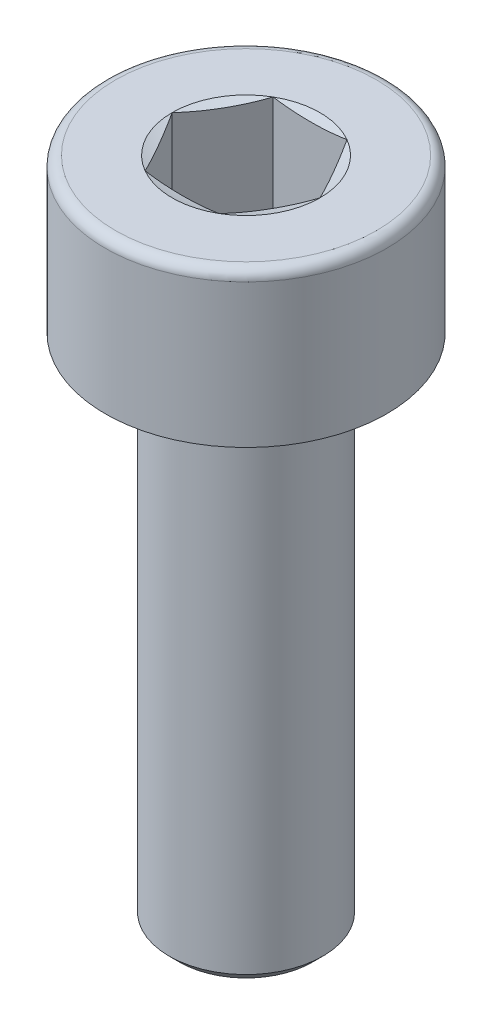
ISO-10303-21;
HEADER;
FILE_DESCRIPTION(('STEP AP214'),'2;1');
FILE_NAME('part.step','',(''),(''),'','','');
FILE_SCHEMA(('AUTOMOTIVE_DESIGN { 1 0 10303 214 1 1 1 1 }'));
ENDSEC;
DATA;
#1=APPLICATION_CONTEXT('core data for automotive mechanical design processes');
#2=APPLICATION_PROTOCOL_DEFINITION('international standard','automotive_design',2000,#1);
#3=PRODUCT_CONTEXT('',#1,'mechanical');
#4=PRODUCT('Part','Part','',(#3));
#5=PRODUCT_RELATED_PRODUCT_CATEGORY('part','',(#4));
#6=PRODUCT_DEFINITION_FORMATION('','',#4);
#7=PRODUCT_DEFINITION_CONTEXT('part definition',#1,'design');
#8=PRODUCT_DEFINITION('design','',#6,#7);
#9=PRODUCT_DEFINITION_SHAPE('','',#8);
#10=(LENGTH_UNIT() NAMED_UNIT(*) SI_UNIT(.MILLI.,.METRE.));
#11=(NAMED_UNIT(*) PLANE_ANGLE_UNIT() SI_UNIT($,.RADIAN.));
#12=(NAMED_UNIT(*) SI_UNIT($,.STERADIAN.) SOLID_ANGLE_UNIT());
#13=UNCERTAINTY_MEASURE_WITH_UNIT(LENGTH_MEASURE(1.E-05),#10,'distance_accuracy_value','');
#14=(GEOMETRIC_REPRESENTATION_CONTEXT(3) GLOBAL_UNCERTAINTY_ASSIGNED_CONTEXT((#13)) GLOBAL_UNIT_ASSIGNED_CONTEXT((#10,
#11,#12)) REPRESENTATION_CONTEXT('',''));
#15=CARTESIAN_POINT('',(0.,0.,0.));
#16=DIRECTION('',(0.,0.,1.));
#17=DIRECTION('',(1.,0.,0.));
#18=AXIS2_PLACEMENT_3D('',#15,#16,#17);
#19=CARTESIAN_POINT('',(-0.721687836487032,1.,1.25));
#20=DIRECTION('',(-0.866025403784438,0.,0.5));
#21=DIRECTION('',(0.5,0.,0.866025403784438));
#22=AXIS2_PLACEMENT_3D('',#19,#20,#21);
#23=PLANE('',#22);
#24=CARTESIAN_POINT('',(-0.721687836487032,3.,1.25));
#25=CARTESIAN_POINT('',(-0.746513124830629,2.99197238531374,1.20700133927634));
#26=CARTESIAN_POINT('',(-0.77141135372941,2.98490176746172,1.16387634180517));
#27=CARTESIAN_POINT('',(-0.821315773136171,2.97255913474823,1.07743935187044));
#28=CARTESIAN_POINT('',(-0.846321947696915,2.96728686283765,1.03412738702829));
#29=CARTESIAN_POINT('',(-0.921207679089363,2.95403550093664,0.904421495494619));
#30=CARTESIAN_POINT('',(-0.971201450687432,2.94854460534836,0.817829743024769));
#31=CARTESIAN_POINT('',(-1.05639422799085,2.94434178449894,0.670271524297353));
#32=CARTESIAN_POINT('',(-1.091578665675,2.94410115539927,0.609330290592659));
#33=CARTESIAN_POINT('',(-1.16192112047074,2.94660140173926,0.487493584957328));
#34=CARTESIAN_POINT('',(-1.19707913913524,2.94934208553123,0.426598110336958));
#35=CARTESIAN_POINT('',(-1.26754233377786,2.95799567884213,0.304552277152318));
#36=CARTESIAN_POINT('',(-1.30284686200085,2.96393024637964,0.243403040532844));
#37=CARTESIAN_POINT('',(-1.37327394982157,2.9792802908976,0.121419746198257));
#38=CARTESIAN_POINT('',(-1.40839646122585,2.98869664635053,0.0605857719566225));
#39=CARTESIAN_POINT('',(-1.44337567297407,3.,0.));
#40=B_SPLINE_CURVE_WITH_KNOTS('',3,(#24,#25,#26,#27,#28,#29,#30,#31,#32,#33,#34,#35,#36,#37,#38,
#39),.UNSPECIFIED.,.F.,.F.,(4,2,2,2,2,2,2,4),(0.,0.150861973818663,0.301702374924401,
0.601886293911623,0.812941524612173,1.02398318885367,1.23647431745907,1.44901909526101),.UNSPECIFIED.);
#41=CARTESIAN_POINT('',(-0.721687836487033,3.,1.25));
#42=VERTEX_POINT('',#41);
#43=CARTESIAN_POINT('',(-1.44337567297406,3.,0.));
#44=VERTEX_POINT('',#43);
#45=EDGE_CURVE('E81',#42,#44,#40,.T.);
#46=ORIENTED_EDGE('',*,*,#45,.F.);
#47=DIRECTION('',(0.,1.,0.));
#48=VECTOR('',#47,1.);
#49=CARTESIAN_POINT('',(-0.721687836487032,1.,1.25));
#50=LINE('',#49,#48);
#51=CARTESIAN_POINT('',(-0.721687836487032,1.,1.25));
#52=VERTEX_POINT('',#51);
#53=EDGE_CURVE('E117',#42,#52,#50,.F.);
#54=ORIENTED_EDGE('',*,*,#53,.T.);
#55=DIRECTION('',(0.5,0.,0.866025403784438));
#56=VECTOR('',#55,1.);
#57=CARTESIAN_POINT('',(-0.721687836487032,1.,1.25));
#58=LINE('',#57,#56);
#59=CARTESIAN_POINT('',(-1.44337567297406,1.,0.));
#60=VERTEX_POINT('',#59);
#61=EDGE_CURVE('E90',#60,#52,#58,.T.);
#62=ORIENTED_EDGE('',*,*,#61,.F.);
#63=DIRECTION('',(0.,1.,0.));
#64=VECTOR('',#63,1.);
#65=CARTESIAN_POINT('',(-1.44337567297406,1.,0.));
#66=LINE('',#65,#64);
#67=EDGE_CURVE('E89',#60,#44,#66,.T.);
#68=ORIENTED_EDGE('',*,*,#67,.T.);
#69=EDGE_LOOP('',(#46,#54,#62,#68));
#70=FACE_BOUND('',#69,.T.);
#71=ADVANCED_FACE('F17',(#70),#23,.F.);
#72=CARTESIAN_POINT('',(-1.44337567297406,1.,0.));
#73=DIRECTION('',(-0.866025403784439,0.,-0.5));
#74=DIRECTION('',(-0.5,0.,0.866025403784439));
#75=AXIS2_PLACEMENT_3D('',#72,#73,#74);
#76=PLANE('',#75);
#77=CARTESIAN_POINT('',(-1.44337567297407,3.,0.));
#78=CARTESIAN_POINT('',(-1.41855038463047,2.99197238531374,-0.0429986607236554));
#79=CARTESIAN_POINT('',(-1.39365215573169,2.98490176746172,-0.0861236581948242));
#80=CARTESIAN_POINT('',(-1.34374773632493,2.97255913474823,-0.17256064812956));
#81=CARTESIAN_POINT('',(-1.31874156176418,2.96728686283765,-0.215872612971706));
#82=CARTESIAN_POINT('',(-1.24385583037174,2.95403550093664,-0.34557850450538));
#83=CARTESIAN_POINT('',(-1.19386205877367,2.94854460534836,-0.43217025697523));
#84=CARTESIAN_POINT('',(-1.10866928147025,2.94434178449894,-0.579728475702645));
#85=CARTESIAN_POINT('',(-1.0734848437861,2.94410115539927,-0.640669709407339));
#86=CARTESIAN_POINT('',(-1.00314238899036,2.94660140173926,-0.762506415042671));
#87=CARTESIAN_POINT('',(-0.967984370325862,2.94934208553123,-0.823401889663041));
#88=CARTESIAN_POINT('',(-0.897521175683237,2.95799567884213,-0.945447722847682));
#89=CARTESIAN_POINT('',(-0.862216647460244,2.96393024637964,-1.00659695946716));
#90=CARTESIAN_POINT('',(-0.791789559639532,2.9792802908976,-1.12858025380174));
#91=CARTESIAN_POINT('',(-0.75666704823525,2.98869664635053,-1.18941422804338));
#92=CARTESIAN_POINT('',(-0.721687836487033,3.,-1.25));
#93=B_SPLINE_CURVE_WITH_KNOTS('',3,(#77,#78,#79,#80,#81,#82,#83,#84,#85,#86,#87,#88,#89,#90,#91,
#92),.UNSPECIFIED.,.F.,.F.,(4,2,2,2,2,2,2,4),(0.,0.150861973818663,0.3017023749244,
0.601886293911622,0.812941524612172,1.02398318885367,1.23647431745907,1.44901909526101),.UNSPECIFIED.);
#94=CARTESIAN_POINT('',(-0.721687836487032,3.,-1.25));
#95=VERTEX_POINT('',#94);
#96=EDGE_CURVE('E96',#44,#95,#93,.T.);
#97=ORIENTED_EDGE('',*,*,#96,.F.);
#98=ORIENTED_EDGE('',*,*,#67,.F.);
#99=DIRECTION('',(0.5,0.,-0.866025403784439));
#100=VECTOR('',#99,1.);
#101=CARTESIAN_POINT('',(-1.44337567297406,1.,0.));
#102=LINE('',#101,#100);
#103=CARTESIAN_POINT('',(-0.721687836487033,1.,-1.25));
#104=VERTEX_POINT('',#103);
#105=EDGE_CURVE('E228',#60,#104,#102,.T.);
#106=ORIENTED_EDGE('',*,*,#105,.T.);
#107=DIRECTION('',(0.,1.,0.));
#108=VECTOR('',#107,1.);
#109=CARTESIAN_POINT('',(-0.721687836487033,1.,-1.25));
#110=LINE('',#109,#108);
#111=EDGE_CURVE('E115',#104,#95,#110,.T.);
#112=ORIENTED_EDGE('',*,*,#111,.T.);
#113=EDGE_LOOP('',(#97,#98,#106,#112));
#114=FACE_BOUND('',#113,.T.);
#115=ADVANCED_FACE('F113',(#114),#76,.F.);
#116=CARTESIAN_POINT('',(0.721687836487032,1.,1.25));
#117=DIRECTION('',(0.,0.,1.));
#118=DIRECTION('',(1.,0.,0.));
#119=AXIS2_PLACEMENT_3D('',#116,#117,#118);
#120=PLANE('',#119);
#121=CARTESIAN_POINT('',(0.721687836487032,3.,1.25));
#122=CARTESIAN_POINT('',(0.67203725979984,2.99197238531374,1.25));
#123=CARTESIAN_POINT('',(0.622240802002277,2.98490176746172,1.25));
#124=CARTESIAN_POINT('',(0.522431963188756,2.97255913474823,1.25));
#125=CARTESIAN_POINT('',(0.472419614067266,2.96728686283765,1.25));
#126=CARTESIAN_POINT('',(0.322648151282372,2.95403550093664,1.25));
#127=CARTESIAN_POINT('',(0.222660608086233,2.94854460534836,1.25));
#128=CARTESIAN_POINT('',(0.0522750534794036,2.94434178449894,1.25));
#129=CARTESIAN_POINT('',(-0.0180938218889027,2.94410115539927,1.25));
#130=CARTESIAN_POINT('',(-0.158778731480374,2.94660140173926,1.25));
#131=CARTESIAN_POINT('',(-0.229094768809375,2.94934208553123,1.25));
#132=CARTESIAN_POINT('',(-0.370021158094624,2.95799567884213,1.25));
#133=CARTESIAN_POINT('',(-0.44063021454061,2.96393024637964,1.25));
#134=CARTESIAN_POINT('',(-0.581484390182033,2.9792802908976,1.25));
#135=CARTESIAN_POINT('',(-0.651729412990598,2.98869664635053,1.25));
#136=CARTESIAN_POINT('',(-0.721687836487032,3.,1.25));
#137=B_SPLINE_CURVE_WITH_KNOTS('',3,(#121,#122,#123,#124,#125,#126,#127,#128,#129,#130,#131,
#132,#133,#134,#135,#136),.UNSPECIFIED.,.F.,.F.,(4,2,2,2,2,2,2,4),(0.,0.150861973818663,
0.301702374924401,0.601886293911623,0.812941524612173,1.02398318885367,1.23647431745907,
1.44901909526101),.UNSPECIFIED.);
#138=CARTESIAN_POINT('',(0.721687836487031,3.,1.25));
#139=VERTEX_POINT('',#138);
#140=EDGE_CURVE('E75',#139,#42,#137,.T.);
#141=ORIENTED_EDGE('',*,*,#140,.F.);
#142=DIRECTION('',(0.,1.,0.));
#143=VECTOR('',#142,1.);
#144=CARTESIAN_POINT('',(0.721687836487032,1.,1.25));
#145=LINE('',#144,#143);
#146=CARTESIAN_POINT('',(0.721687836487032,1.,1.25));
#147=VERTEX_POINT('',#146);
#148=EDGE_CURVE('E211',#139,#147,#145,.F.);
#149=ORIENTED_EDGE('',*,*,#148,.T.);
#150=DIRECTION('',(1.,0.,0.));
#151=VECTOR('',#150,1.);
#152=CARTESIAN_POINT('',(-0.721687836487033,1.,1.25));
#153=LINE('',#152,#151);
#154=EDGE_CURVE('E232',#147,#52,#153,.F.);
#155=ORIENTED_EDGE('',*,*,#154,.T.);
#156=ORIENTED_EDGE('',*,*,#53,.F.);
#157=EDGE_LOOP('',(#141,#149,#155,#156));
#158=FACE_BOUND('',#157,.T.);
#159=ADVANCED_FACE('F138',(#158),#120,.F.);
#160=CARTESIAN_POINT('',(-0.721687836487033,1.,-1.25));
#161=DIRECTION('',(0.,-1.,0.));
#162=DIRECTION('',(0.,0.,-1.));
#163=AXIS2_PLACEMENT_3D('',#160,#161,#162);
#164=PLANE('',#163);
#165=ORIENTED_EDGE('',*,*,#61,.T.);
#166=ORIENTED_EDGE('',*,*,#154,.F.);
#167=DIRECTION('',(0.5,0.,-0.866025403784438));
#168=VECTOR('',#167,1.);
#169=CARTESIAN_POINT('',(1.44337567297406,1.,0.));
#170=LINE('',#169,#168);
#171=CARTESIAN_POINT('',(1.44337567297406,1.,0.));
#172=VERTEX_POINT('',#171);
#173=EDGE_CURVE('E160',#147,#172,#170,.T.);
#174=ORIENTED_EDGE('',*,*,#173,.T.);
#175=DIRECTION('',(-0.5,0.,-0.866025403784439));
#176=VECTOR('',#175,1.);
#177=CARTESIAN_POINT('',(0.721687836487033,1.,-1.25));
#178=LINE('',#177,#176);
#179=CARTESIAN_POINT('',(0.721687836487033,1.,-1.25));
#180=VERTEX_POINT('',#179);
#181=EDGE_CURVE('E208',#172,#180,#178,.T.);
#182=ORIENTED_EDGE('',*,*,#181,.T.);
#183=DIRECTION('',(-1.,0.,0.));
#184=VECTOR('',#183,1.);
#185=CARTESIAN_POINT('',(-0.721687836487033,1.,-1.25));
#186=LINE('',#185,#184);
#187=EDGE_CURVE('E223',#180,#104,#186,.T.);
#188=ORIENTED_EDGE('',*,*,#187,.T.);
#189=ORIENTED_EDGE('',*,*,#105,.F.);
#190=EDGE_LOOP('',(#165,#166,#174,#182,#188,#189));
#191=FACE_BOUND('',#190,.T.);
#192=ADVANCED_FACE('F142',(#191),#164,.F.);
#193=CARTESIAN_POINT('',(-0.721687836487033,1.,-1.25));
#194=DIRECTION('',(0.,0.,-1.));
#195=DIRECTION('',(-1.,0.,0.));
#196=AXIS2_PLACEMENT_3D('',#193,#194,#195);
#197=PLANE('',#196);
#198=CARTESIAN_POINT('',(-0.721687836487032,3.,-1.25));
#199=CARTESIAN_POINT('',(-0.67203725979984,2.99197238531374,-1.25));
#200=CARTESIAN_POINT('',(-0.622240802002278,2.98490176746172,-1.25));
#201=CARTESIAN_POINT('',(-0.522431963188756,2.97255913474823,-1.25));
#202=CARTESIAN_POINT('',(-0.472419614067267,2.96728686283765,-1.25));
#203=CARTESIAN_POINT('',(-0.322648151282373,2.95403550093664,-1.25));
#204=CARTESIAN_POINT('',(-0.222660608086234,2.94854460534836,-1.25));
#205=CARTESIAN_POINT('',(-0.0522750534794044,2.94434178449894,-1.25));
#206=CARTESIAN_POINT('',(0.0180938218889021,2.94410115539927,-1.25));
#207=CARTESIAN_POINT('',(0.158778731480374,2.94660140173926,-1.25));
#208=CARTESIAN_POINT('',(0.229094768809375,2.94934208553123,-1.25));
#209=CARTESIAN_POINT('',(0.370021158094625,2.95799567884213,-1.25));
#210=CARTESIAN_POINT('',(0.440630214540611,2.96393024637964,-1.25));
#211=CARTESIAN_POINT('',(0.581484390182035,2.9792802908976,-1.25));
#212=CARTESIAN_POINT('',(0.6517294129906,2.98869664635053,-1.25));
#213=CARTESIAN_POINT('',(0.721687836487034,3.,-1.25));
#214=B_SPLINE_CURVE_WITH_KNOTS('',3,(#198,#199,#200,#201,#202,#203,#204,#205,#206,#207,#208,
#209,#210,#211,#212,#213),.UNSPECIFIED.,.F.,.F.,(4,2,2,2,2,2,2,4),(0.,0.150861973818663,
0.3017023749244,0.601886293911622,0.812941524612173,1.02398318885367,1.23647431745908,
1.44901909526101),.UNSPECIFIED.);
#215=CARTESIAN_POINT('',(0.721687836487033,3.,-1.25));
#216=VERTEX_POINT('',#215);
#217=EDGE_CURVE('E155',#95,#216,#214,.T.);
#218=ORIENTED_EDGE('',*,*,#217,.F.);
#219=ORIENTED_EDGE('',*,*,#111,.F.);
#220=ORIENTED_EDGE('',*,*,#187,.F.);
#221=DIRECTION('',(0.,1.,0.));
#222=VECTOR('',#221,1.);
#223=CARTESIAN_POINT('',(0.721687836487033,1.,-1.25));
#224=LINE('',#223,#222);
#225=EDGE_CURVE('E203',#180,#216,#224,.T.);
#226=ORIENTED_EDGE('',*,*,#225,.T.);
#227=EDGE_LOOP('',(#218,#219,#220,#226));
#228=FACE_BOUND('',#227,.T.);
#229=ADVANCED_FACE('F146',(#228),#197,.F.);
#230=CARTESIAN_POINT('',(1.44337567297406,1.,0.));
#231=DIRECTION('',(0.866025403784438,0.,0.5));
#232=DIRECTION('',(0.5,0.,-0.866025403784438));
#233=AXIS2_PLACEMENT_3D('',#230,#231,#232);
#234=PLANE('',#233);
#235=CARTESIAN_POINT('',(1.44337567297406,3.,0.));
#236=CARTESIAN_POINT('',(1.41855038463047,2.99197238531374,0.0429986607236574));
#237=CARTESIAN_POINT('',(1.39365215573169,2.98490176746172,0.0861236581948263));
#238=CARTESIAN_POINT('',(1.34374773632493,2.97255913474823,0.172560648129562));
#239=CARTESIAN_POINT('',(1.31874156176418,2.96728686283765,0.215872612971708));
#240=CARTESIAN_POINT('',(1.24385583037173,2.95403550093664,0.345578504505382));
#241=CARTESIAN_POINT('',(1.19386205877366,2.94854460534836,0.432170256975232));
#242=CARTESIAN_POINT('',(1.10866928147025,2.94434178449894,0.579728475702648));
#243=CARTESIAN_POINT('',(1.0734848437861,2.94410115539927,0.640669709407342));
#244=CARTESIAN_POINT('',(1.00314238899036,2.94660140173926,0.762506415042673));
#245=CARTESIAN_POINT('',(0.967984370325861,2.94934208553123,0.823401889663042));
#246=CARTESIAN_POINT('',(0.897521175683236,2.95799567884213,0.945447722847683));
#247=CARTESIAN_POINT('',(0.862216647460243,2.96393024637964,1.00659695946716));
#248=CARTESIAN_POINT('',(0.791789559639532,2.9792802908976,1.12858025380174));
#249=CARTESIAN_POINT('',(0.756667048235249,2.98869664635053,1.18941422804338));
#250=CARTESIAN_POINT('',(0.721687836487033,3.,1.25));
#251=B_SPLINE_CURVE_WITH_KNOTS('',3,(#235,#236,#237,#238,#239,#240,#241,#242,#243,#244,#245,
#246,#247,#248,#249,#250),.UNSPECIFIED.,.F.,.F.,(4,2,2,2,2,2,2,4),(0.,0.150861973818663,
0.301702374924401,0.601886293911623,0.812941524612172,1.02398318885367,1.23647431745907,
1.449019095261),.UNSPECIFIED.);
#252=CARTESIAN_POINT('',(1.44337567297406,3.,0.));
#253=VERTEX_POINT('',#252);
#254=EDGE_CURVE('E161',#253,#139,#251,.T.);
#255=ORIENTED_EDGE('',*,*,#254,.F.);
#256=DIRECTION('',(0.,1.,0.));
#257=VECTOR('',#256,1.);
#258=CARTESIAN_POINT('',(1.44337567297407,1.,0.));
#259=LINE('',#258,#257);
#260=EDGE_CURVE('E199',#253,#172,#259,.F.);
#261=ORIENTED_EDGE('',*,*,#260,.T.);
#262=ORIENTED_EDGE('',*,*,#173,.F.);
#263=ORIENTED_EDGE('',*,*,#148,.F.);
#264=EDGE_LOOP('',(#255,#261,#262,#263));
#265=FACE_BOUND('',#264,.T.);
#266=ADVANCED_FACE('F151',(#265),#234,.F.);
#267=CARTESIAN_POINT('',(0.721687836487033,1.,-1.25));
#268=DIRECTION('',(0.866025403784439,0.,-0.5));
#269=DIRECTION('',(-0.5,0.,-0.866025403784439));
#270=AXIS2_PLACEMENT_3D('',#267,#268,#269);
#271=PLANE('',#270);
#272=CARTESIAN_POINT('',(1.44337567297407,3.,0.));
#273=CARTESIAN_POINT('',(1.41855038463047,2.99197238531374,-0.042998660723655));
#274=CARTESIAN_POINT('',(1.39365215573169,2.98490176746172,-0.0861236581948239));
#275=CARTESIAN_POINT('',(1.34374773632493,2.97255913474823,-0.17256064812956));
#276=CARTESIAN_POINT('',(1.31874156176418,2.96728686283765,-0.215872612971706));
#277=CARTESIAN_POINT('',(1.24385583037174,2.95403550093664,-0.34557850450538));
#278=CARTESIAN_POINT('',(1.19386205877367,2.94854460534836,-0.43217025697523));
#279=CARTESIAN_POINT('',(1.10866928147025,2.94434178449894,-0.579728475702645));
#280=CARTESIAN_POINT('',(1.0734848437861,2.94410115539927,-0.64066970940734));
#281=CARTESIAN_POINT('',(1.00314238899036,2.94660140173926,-0.762506415042671));
#282=CARTESIAN_POINT('',(0.967984370325862,2.94934208553123,-0.823401889663041));
#283=CARTESIAN_POINT('',(0.897521175683237,2.95799567884213,-0.945447722847681));
#284=CARTESIAN_POINT('',(0.862216647460244,2.96393024637964,-1.00659695946715));
#285=CARTESIAN_POINT('',(0.791789559639533,2.9792802908976,-1.12858025380174));
#286=CARTESIAN_POINT('',(0.756667048235251,2.98869664635053,-1.18941422804338));
#287=CARTESIAN_POINT('',(0.721687836487034,3.,-1.25));
#288=B_SPLINE_CURVE_WITH_KNOTS('',3,(#272,#273,#274,#275,#276,#277,#278,#279,#280,#281,#282,
#283,#284,#285,#286,#287),.UNSPECIFIED.,.F.,.F.,(4,2,2,2,2,2,2,4),(0.,0.150861973818663,
0.301702374924401,0.601886293911623,0.812941524612173,1.02398318885367,1.23647431745907,
1.44901909526101),.UNSPECIFIED.);
#289=EDGE_CURVE('E202',#253,#216,#288,.T.);
#290=ORIENTED_EDGE('',*,*,#289,.T.);
#291=ORIENTED_EDGE('',*,*,#225,.F.);
#292=ORIENTED_EDGE('',*,*,#181,.F.);
#293=ORIENTED_EDGE('',*,*,#260,.F.);
#294=EDGE_LOOP('',(#290,#291,#292,#293));
#295=FACE_BOUND('',#294,.T.);
#296=ADVANCED_FACE('F194',(#295),#271,.F.);
#297=CARTESIAN_POINT('',(-0.520457544102293,5.85450908693594,0.));
#298=DIRECTION('',(0.,0.,1.));
#299=DIRECTION('',(-1.,0.,0.));
#300=AXIS2_PLACEMENT_3D('',#297,#298,#299);
#301=CIRCLE('',#300,3.);
#302=TRIMMED_CURVE('',#301,(PARAMETER_VALUE(-1.74516442055986)),
(PARAMETER_VALUE(1.74516442055986)),.T.,.PARAMETER.);
#303=CARTESIAN_POINT('',(0.,5.85450908693594,0.));
#304=DIRECTION('',(0.,1.,0.));
#305=AXIS1_PLACEMENT('',#303,#304);
#306=SURFACE_OF_REVOLUTION('',#302,#305);
#307=ORIENTED_EDGE('',*,*,#254,.T.);
#308=CARTESIAN_POINT('',(0.,3.,0.));
#309=DIRECTION('',(0.,1.,0.));
#310=DIRECTION('',(-1.,0.,0.));
#311=AXIS2_PLACEMENT_3D('',#308,#309,#310);
#312=CIRCLE('',#311,1.44337567297406);
#313=EDGE_CURVE('E259',#253,#139,#312,.F.);
#314=ORIENTED_EDGE('',*,*,#313,.F.);
#315=EDGE_LOOP('',(#307,#314));
#316=FACE_BOUND('',#315,.T.);
#317=ADVANCED_FACE('F191',(#316),#306,.T.);
#318=CARTESIAN_POINT('',(-0.520457544102293,5.85450908693594,0.));
#319=DIRECTION('',(0.,0.,1.));
#320=DIRECTION('',(-1.,0.,0.));
#321=AXIS2_PLACEMENT_3D('',#318,#319,#320);
#322=CIRCLE('',#321,3.);
#323=TRIMMED_CURVE('',#322,(PARAMETER_VALUE(-1.74516442055986)),
(PARAMETER_VALUE(1.74516442055986)),.T.,.PARAMETER.);
#324=CARTESIAN_POINT('',(0.,5.85450908693594,0.));
#325=DIRECTION('',(0.,1.,0.));
#326=AXIS1_PLACEMENT('',#324,#325);
#327=SURFACE_OF_REVOLUTION('',#323,#326);
#328=ORIENTED_EDGE('',*,*,#140,.T.);
#329=CARTESIAN_POINT('',(0.,3.,0.));
#330=DIRECTION('',(0.,1.,0.));
#331=DIRECTION('',(-1.,0.,0.));
#332=AXIS2_PLACEMENT_3D('',#329,#330,#331);
#333=CIRCLE('',#332,1.44337567297406);
#334=EDGE_CURVE('E106',#139,#42,#333,.F.);
#335=ORIENTED_EDGE('',*,*,#334,.F.);
#336=EDGE_LOOP('',(#328,#335));
#337=FACE_BOUND('',#336,.T.);
#338=ADVANCED_FACE('F188',(#337),#327,.T.);
#339=CARTESIAN_POINT('',(-0.520457544102293,5.85450908693594,0.));
#340=DIRECTION('',(0.,0.,1.));
#341=DIRECTION('',(-1.,0.,0.));
#342=AXIS2_PLACEMENT_3D('',#339,#340,#341);
#343=CIRCLE('',#342,3.);
#344=TRIMMED_CURVE('',#343,(PARAMETER_VALUE(-1.74516442055986)),
(PARAMETER_VALUE(1.74516442055986)),.T.,.PARAMETER.);
#345=CARTESIAN_POINT('',(0.,5.85450908693594,0.));
#346=DIRECTION('',(0.,1.,0.));
#347=AXIS1_PLACEMENT('',#345,#346);
#348=SURFACE_OF_REVOLUTION('',#344,#347);
#349=ORIENTED_EDGE('',*,*,#45,.T.);
#350=CARTESIAN_POINT('',(0.,3.,0.));
#351=DIRECTION('',(0.,1.,0.));
#352=DIRECTION('',(-1.,0.,0.));
#353=AXIS2_PLACEMENT_3D('',#350,#351,#352);
#354=CIRCLE('',#353,1.44337567297406);
#355=EDGE_CURVE('E85',#42,#44,#354,.F.);
#356=ORIENTED_EDGE('',*,*,#355,.F.);
#357=EDGE_LOOP('',(#349,#356));
#358=FACE_BOUND('',#357,.T.);
#359=ADVANCED_FACE('F83',(#358),#348,.T.);
#360=CARTESIAN_POINT('',(-0.520457544102293,5.85450908693594,0.));
#361=DIRECTION('',(0.,0.,1.));
#362=DIRECTION('',(-1.,0.,0.));
#363=AXIS2_PLACEMENT_3D('',#360,#361,#362);
#364=CIRCLE('',#363,3.);
#365=TRIMMED_CURVE('',#364,(PARAMETER_VALUE(-1.74516442055986)),
(PARAMETER_VALUE(1.74516442055986)),.T.,.PARAMETER.);
#366=CARTESIAN_POINT('',(0.,5.85450908693594,0.));
#367=DIRECTION('',(0.,1.,0.));
#368=AXIS1_PLACEMENT('',#366,#367);
#369=SURFACE_OF_REVOLUTION('',#365,#368);
#370=ORIENTED_EDGE('',*,*,#96,.T.);
#371=CARTESIAN_POINT('',(0.,3.,0.));
#372=DIRECTION('',(0.,1.,0.));
#373=DIRECTION('',(-1.,0.,0.));
#374=AXIS2_PLACEMENT_3D('',#371,#372,#373);
#375=CIRCLE('',#374,1.44337567297406);
#376=EDGE_CURVE('E103',#44,#95,#375,.F.);
#377=ORIENTED_EDGE('',*,*,#376,.F.);
#378=EDGE_LOOP('',(#370,#377));
#379=FACE_BOUND('',#378,.T.);
#380=ADVANCED_FACE('F109',(#379),#369,.T.);
#381=CARTESIAN_POINT('',(-0.520457544102293,5.85450908693594,0.));
#382=DIRECTION('',(0.,0.,1.));
#383=DIRECTION('',(-1.,0.,0.));
#384=AXIS2_PLACEMENT_3D('',#381,#382,#383);
#385=CIRCLE('',#384,3.);
#386=TRIMMED_CURVE('',#385,(PARAMETER_VALUE(-1.74516442055986)),
(PARAMETER_VALUE(1.74516442055986)),.T.,.PARAMETER.);
#387=CARTESIAN_POINT('',(0.,5.85450908693594,0.));
#388=DIRECTION('',(0.,1.,0.));
#389=AXIS1_PLACEMENT('',#387,#388);
#390=SURFACE_OF_REVOLUTION('',#386,#389);
#391=ORIENTED_EDGE('',*,*,#217,.T.);
#392=CARTESIAN_POINT('',(0.,3.,0.));
#393=DIRECTION('',(0.,1.,0.));
#394=DIRECTION('',(-1.,0.,0.));
#395=AXIS2_PLACEMENT_3D('',#392,#393,#394);
#396=CIRCLE('',#395,1.44337567297406);
#397=EDGE_CURVE('E111',#95,#216,#396,.F.);
#398=ORIENTED_EDGE('',*,*,#397,.F.);
#399=EDGE_LOOP('',(#391,#398));
#400=FACE_BOUND('',#399,.T.);
#401=ADVANCED_FACE('F167',(#400),#390,.T.);
#402=CARTESIAN_POINT('',(-0.520457544102293,5.85450908693594,0.));
#403=DIRECTION('',(0.,0.,1.));
#404=DIRECTION('',(-1.,0.,0.));
#405=AXIS2_PLACEMENT_3D('',#402,#403,#404);
#406=CIRCLE('',#405,3.);
#407=TRIMMED_CURVE('',#406,(PARAMETER_VALUE(-1.74516442055986)),
(PARAMETER_VALUE(1.74516442055986)),.T.,.PARAMETER.);
#408=CARTESIAN_POINT('',(0.,5.85450908693594,0.));
#409=DIRECTION('',(0.,1.,0.));
#410=AXIS1_PLACEMENT('',#408,#409);
#411=SURFACE_OF_REVOLUTION('',#407,#410);
#412=ORIENTED_EDGE('',*,*,#289,.F.);
#413=CARTESIAN_POINT('',(0.,3.,0.));
#414=DIRECTION('',(0.,1.,0.));
#415=DIRECTION('',(-1.,0.,0.));
#416=AXIS2_PLACEMENT_3D('',#413,#414,#415);
#417=CIRCLE('',#416,1.44337567297406);
#418=EDGE_CURVE('E254',#216,#253,#417,.F.);
#419=ORIENTED_EDGE('',*,*,#418,.F.);
#420=EDGE_LOOP('',(#412,#419));
#421=FACE_BOUND('',#420,.T.);
#422=ADVANCED_FACE('F172',(#421),#411,.T.);
#423=CARTESIAN_POINT('',(0.,3.,0.));
#424=DIRECTION('',(0.,1.,0.));
#425=DIRECTION('',(0.,0.,1.));
#426=AXIS2_PLACEMENT_3D('',#423,#424,#425);
#427=PLANE('',#426);
#428=CARTESIAN_POINT('',(0.,3.,0.));
#429=DIRECTION('',(0.,-1.,0.));
#430=DIRECTION('',(0.,0.,-1.));
#431=AXIS2_PLACEMENT_3D('',#428,#429,#430);
#432=CIRCLE('',#431,2.55);
#433=CARTESIAN_POINT('',(0.,3.,-2.55));
#434=VERTEX_POINT('',#433);
#435=CARTESIAN_POINT('',(0.,3.,2.55));
#436=VERTEX_POINT('',#435);
#437=EDGE_CURVE('E37',#434,#436,#432,.T.);
#438=ORIENTED_EDGE('',*,*,#437,.F.);
#439=CARTESIAN_POINT('',(0.,3.,0.));
#440=DIRECTION('',(0.,-1.,0.));
#441=DIRECTION('',(0.,0.,1.));
#442=AXIS2_PLACEMENT_3D('',#439,#440,#441);
#443=CIRCLE('',#442,2.55);
#444=EDGE_CURVE('E327',#436,#434,#443,.T.);
#445=ORIENTED_EDGE('',*,*,#444,.F.);
#446=EDGE_LOOP('',(#438,#445));
#447=FACE_BOUND('',#446,.T.);
#448=ORIENTED_EDGE('',*,*,#397,.T.);
#449=ORIENTED_EDGE('',*,*,#418,.T.);
#450=ORIENTED_EDGE('',*,*,#313,.T.);
#451=ORIENTED_EDGE('',*,*,#334,.T.);
#452=ORIENTED_EDGE('',*,*,#355,.T.);
#453=ORIENTED_EDGE('',*,*,#376,.T.);
#454=EDGE_LOOP('',(#448,#449,#450,#451,#452,#453));
#455=FACE_BOUND('',#454,.T.);
#456=ADVANCED_FACE('F102',(#447,#455),#427,.T.);
#457=CARTESIAN_POINT('',(0.,2.8,0.));
#458=DIRECTION('',(0.,1.,0.));
#459=DIRECTION('',(0.,0.,1.));
#460=AXIS2_PLACEMENT_3D('',#457,#458,#459);
#461=TOROIDAL_SURFACE('',#460,2.55,0.2);
#462=CARTESIAN_POINT('',(0.,2.8,0.));
#463=DIRECTION('',(0.,-1.,0.));
#464=DIRECTION('',(0.,0.,-1.));
#465=AXIS2_PLACEMENT_3D('',#462,#463,#464);
#466=CIRCLE('',#465,2.75);
#467=CARTESIAN_POINT('',(0.,2.8,-2.75));
#468=VERTEX_POINT('',#467);
#469=EDGE_CURVE('E253',#468,#468,#466,.T.);
#470=ORIENTED_EDGE('',*,*,#469,.F.);
#471=EDGE_LOOP('',(#470));
#472=FACE_BOUND('',#471,.T.);
#473=ORIENTED_EDGE('',*,*,#444,.T.);
#474=ORIENTED_EDGE('',*,*,#437,.T.);
#475=EDGE_LOOP('',(#473,#474));
#476=FACE_BOUND('',#475,.T.);
#477=ADVANCED_FACE('F304',(#472,#476),#461,.T.);
#478=CARTESIAN_POINT('',(0.,-10.,0.));
#479=DIRECTION('',(0.,-1.,0.));
#480=DIRECTION('',(0.,0.,-1.));
#481=AXIS2_PLACEMENT_3D('',#478,#479,#480);
#482=PLANE('',#481);
#483=CARTESIAN_POINT('',(0.,-9.99999999999091,0.));
#484=DIRECTION('',(0.,1.,0.));
#485=DIRECTION('',(0.,0.,1.));
#486=AXIS2_PLACEMENT_3D('',#483,#484,#485);
#487=CIRCLE('',#486,1.30000000001473);
#488=CARTESIAN_POINT('',(0.,-9.99999999999091,1.30000000001473));
#489=VERTEX_POINT('',#488);
#490=EDGE_CURVE('E250',#489,#489,#487,.T.);
#491=ORIENTED_EDGE('',*,*,#490,.F.);
#492=EDGE_LOOP('',(#491));
#493=FACE_BOUND('',#492,.T.);
#494=ADVANCED_FACE('F301',(#493),#482,.T.);
#495=CARTESIAN_POINT('',(0.,3.,0.));
#496=DIRECTION('',(0.,-1.,0.));
#497=DIRECTION('',(0.,0.,-1.));
#498=AXIS2_PLACEMENT_3D('',#495,#496,#497);
#499=CYLINDRICAL_SURFACE('',#498,2.75);
#500=ORIENTED_EDGE('',*,*,#469,.T.);
#501=EDGE_LOOP('',(#500));
#502=FACE_BOUND('',#501,.T.);
#503=CARTESIAN_POINT('',(0.,0.,0.));
#504=DIRECTION('',(0.,-1.,0.));
#505=DIRECTION('',(0.,0.,-1.));
#506=AXIS2_PLACEMENT_3D('',#503,#504,#505);
#507=CIRCLE('',#506,2.75);
#508=CARTESIAN_POINT('',(0.,0.,-2.75));
#509=VERTEX_POINT('',#508);
#510=EDGE_CURVE('E247',#509,#509,#507,.F.);
#511=ORIENTED_EDGE('',*,*,#510,.T.);
#512=EDGE_LOOP('',(#511));
#513=FACE_BOUND('',#512,.T.);
#514=ADVANCED_FACE('F297',(#502,#513),#499,.T.);
#515=CARTESIAN_POINT('',(0.,-9.80000000004111,0.));
#516=DIRECTION('',(0.,1.,0.));
#517=DIRECTION('',(0.,0.,1.));
#518=AXIS2_PLACEMENT_3D('',#515,#516,#517);
#519=CONICAL_SURFACE('',#518,1.49999999990769,0.78539816325534);
#520=CARTESIAN_POINT('',(0.,-9.8,0.));
#521=DIRECTION('',(0.,1.,0.));
#522=DIRECTION('',(0.,0.,1.));
#523=AXIS2_PLACEMENT_3D('',#520,#521,#522);
#524=CIRCLE('',#523,1.5);
#525=CARTESIAN_POINT('',(0.,-9.8,1.5));
#526=VERTEX_POINT('',#525);
#527=EDGE_CURVE('E29',#526,#526,#524,.T.);
#528=ORIENTED_EDGE('',*,*,#527,.F.);
#529=EDGE_LOOP('',(#528));
#530=FACE_BOUND('',#529,.T.);
#531=ORIENTED_EDGE('',*,*,#490,.T.);
#532=EDGE_LOOP('',(#531));
#533=FACE_BOUND('',#532,.T.);
#534=ADVANCED_FACE('F290',(#530,#533),#519,.T.);
#535=CARTESIAN_POINT('',(0.,0.,0.));
#536=DIRECTION('',(0.,1.,0.));
#537=DIRECTION('',(0.,0.,1.));
#538=AXIS2_PLACEMENT_3D('',#535,#536,#537);
#539=PLANE('',#538);
#540=CARTESIAN_POINT('',(0.,0.,0.));
#541=DIRECTION('',(0.,1.,0.));
#542=DIRECTION('',(0.,0.,1.));
#543=AXIS2_PLACEMENT_3D('',#540,#541,#542);
#544=CIRCLE('',#543,1.5);
#545=CARTESIAN_POINT('',(0.,0.,1.5));
#546=VERTEX_POINT('',#545);
#547=EDGE_CURVE('E11',#546,#546,#544,.F.);
#548=ORIENTED_EDGE('',*,*,#547,.F.);
#549=EDGE_LOOP('',(#548));
#550=FACE_BOUND('',#549,.T.);
#551=ORIENTED_EDGE('',*,*,#510,.F.);
#552=EDGE_LOOP('',(#551));
#553=FACE_BOUND('',#552,.T.);
#554=ADVANCED_FACE('F284',(#550,#553),#539,.F.);
#555=CARTESIAN_POINT('',(0.,-10.,0.));
#556=DIRECTION('',(0.,1.,0.));
#557=DIRECTION('',(0.,0.,1.));
#558=AXIS2_PLACEMENT_3D('',#555,#556,#557);
#559=CYLINDRICAL_SURFACE('',#558,1.5);
#560=ORIENTED_EDGE('',*,*,#547,.T.);
#561=EDGE_LOOP('',(#560));
#562=FACE_BOUND('',#561,.T.);
#563=ORIENTED_EDGE('',*,*,#527,.T.);
#564=EDGE_LOOP('',(#563));
#565=FACE_BOUND('',#564,.T.);
#566=ADVANCED_FACE('F282',(#562,#565),#559,.T.);
#567=CLOSED_SHELL('',(#71,#115,#159,#192,#229,#266,#296,#317,#338,#359,#380,#401,#422,#456,#477,
#494,#514,#534,#554,#566));
#568=MANIFOLD_SOLID_BREP('B1',#567);
#569=ADVANCED_BREP_SHAPE_REPRESENTATION('',(#18,#568),#14);
#570=SHAPE_DEFINITION_REPRESENTATION(#9,#569);
ENDSEC;
END-ISO-10303-21;
